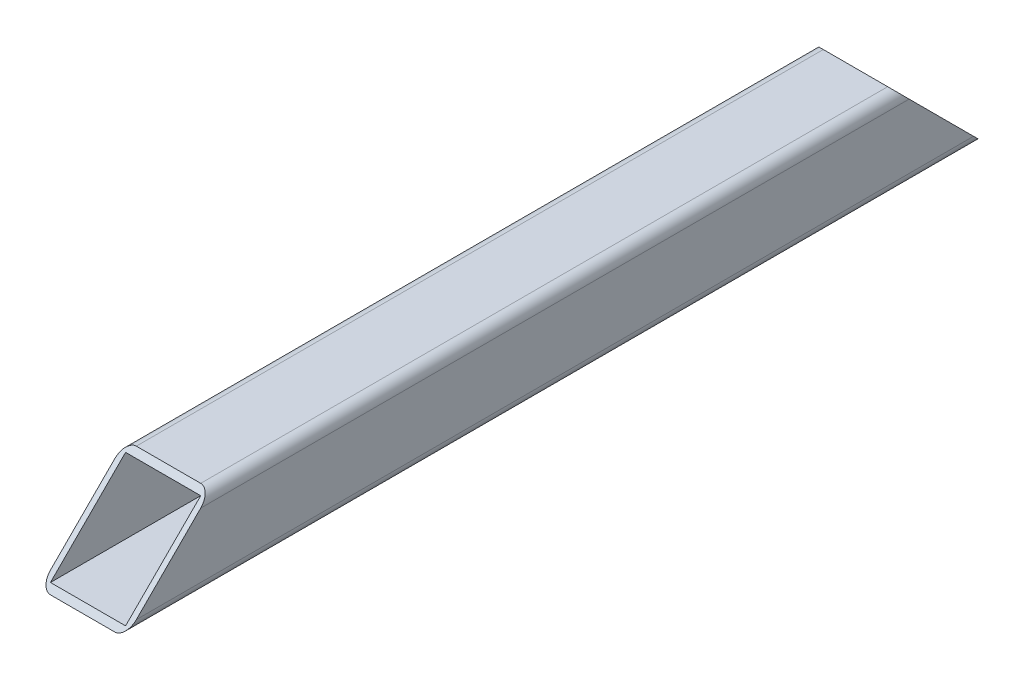
ISO-10303-21;
HEADER;
FILE_DESCRIPTION(('STEP AP214'),'2;1');
FILE_NAME('part.step','',(''),(''),'','','');
FILE_SCHEMA(('AUTOMOTIVE_DESIGN { 1 0 10303 214 1 1 1 1 }'));
ENDSEC;
DATA;
#1=APPLICATION_CONTEXT('core data for automotive mechanical design processes');
#2=APPLICATION_PROTOCOL_DEFINITION('international standard','automotive_design',2000,#1);
#3=PRODUCT_CONTEXT('',#1,'mechanical');
#4=PRODUCT('Part','Part','',(#3));
#5=PRODUCT_RELATED_PRODUCT_CATEGORY('part','',(#4));
#6=PRODUCT_DEFINITION_FORMATION('','',#4);
#7=PRODUCT_DEFINITION_CONTEXT('part definition',#1,'design');
#8=PRODUCT_DEFINITION('design','',#6,#7);
#9=PRODUCT_DEFINITION_SHAPE('','',#8);
#10=(LENGTH_UNIT() NAMED_UNIT(*) SI_UNIT(.MILLI.,.METRE.));
#11=(NAMED_UNIT(*) PLANE_ANGLE_UNIT() SI_UNIT($,.RADIAN.));
#12=(NAMED_UNIT(*) SI_UNIT($,.STERADIAN.) SOLID_ANGLE_UNIT());
#13=UNCERTAINTY_MEASURE_WITH_UNIT(LENGTH_MEASURE(1.E-05),#10,'distance_accuracy_value','');
#14=(GEOMETRIC_REPRESENTATION_CONTEXT(3) GLOBAL_UNCERTAINTY_ASSIGNED_CONTEXT((#13)) GLOBAL_UNIT_ASSIGNED_CONTEXT((#10,
#11,#12)) REPRESENTATION_CONTEXT('',''));
#15=CARTESIAN_POINT('',(0.,0.,0.));
#16=DIRECTION('',(0.,0.,1.));
#17=DIRECTION('',(1.,0.,0.));
#18=AXIS2_PLACEMENT_3D('',#15,#16,#17);
#19=CARTESIAN_POINT('',(-25.4,-25.4,254.));
#20=DIRECTION('',(1.,0.,0.));
#21=DIRECTION('',(0.,0.,-1.));
#22=AXIS2_PLACEMENT_3D('',#19,#20,#21);
#23=PLANE('',#22);
#24=DIRECTION('',(0.,0.,-1.));
#25=VECTOR('',#24,1.);
#26=CARTESIAN_POINT('',(-25.4,19.05,254.));
#27=LINE('',#26,#25);
#28=CARTESIAN_POINT('',(-25.4,19.05,209.55));
#29=VERTEX_POINT('',#28);
#30=CARTESIAN_POINT('',(-25.4,19.05,-209.55));
#31=VERTEX_POINT('',#30);
#32=EDGE_CURVE('E162',#29,#31,#27,.T.);
#33=ORIENTED_EDGE('',*,*,#32,.T.);
#34=DIRECTION('',(0.,0.707106781186551,0.707106781186544));
#35=VECTOR('',#34,1.);
#36=CARTESIAN_POINT('',(-25.4,-25.4,-254.));
#37=LINE('',#36,#35);
#38=CARTESIAN_POINT('',(-25.4,-19.05,-247.65));
#39=VERTEX_POINT('',#38);
#40=EDGE_CURVE('E207',#39,#31,#37,.T.);
#41=ORIENTED_EDGE('',*,*,#40,.F.);
#42=DIRECTION('',(0.,0.,-1.));
#43=VECTOR('',#42,1.);
#44=CARTESIAN_POINT('',(-25.4,-19.05,254.));
#45=LINE('',#44,#43);
#46=CARTESIAN_POINT('',(-25.4,-19.05,247.65));
#47=VERTEX_POINT('',#46);
#48=EDGE_CURVE('E166',#39,#47,#45,.F.);
#49=ORIENTED_EDGE('',*,*,#48,.T.);
#50=DIRECTION('',(0.,-0.707106781186551,0.707106781186544));
#51=VECTOR('',#50,1.);
#52=CARTESIAN_POINT('',(-25.4,-25.4,254.));
#53=LINE('',#52,#51);
#54=EDGE_CURVE('E197',#29,#47,#53,.T.);
#55=ORIENTED_EDGE('',*,*,#54,.F.);
#56=EDGE_LOOP('',(#33,#41,#49,#55));
#57=FACE_BOUND('',#56,.T.);
#58=ADVANCED_FACE('F38',(#57),#23,.F.);
#59=CARTESIAN_POINT('',(25.4,-25.4,254.));
#60=DIRECTION('',(0.,1.,0.));
#61=DIRECTION('',(-1.,0.,0.));
#62=AXIS2_PLACEMENT_3D('',#59,#60,#61);
#63=PLANE('',#62);
#64=DIRECTION('',(1.,0.,0.));
#65=VECTOR('',#64,1.);
#66=CARTESIAN_POINT('',(25.4,-25.4,-254.));
#67=LINE('',#66,#65);
#68=CARTESIAN_POINT('',(-19.05,-25.4,-254.));
#69=VERTEX_POINT('',#68);
#70=CARTESIAN_POINT('',(19.05,-25.4,-254.));
#71=VERTEX_POINT('',#70);
#72=EDGE_CURVE('E137',#69,#71,#67,.T.);
#73=ORIENTED_EDGE('',*,*,#72,.T.);
#74=DIRECTION('',(0.,0.,-1.));
#75=VECTOR('',#74,1.);
#76=CARTESIAN_POINT('',(19.05,-25.4,254.));
#77=LINE('',#76,#75);
#78=CARTESIAN_POINT('',(19.05,-25.4,254.));
#79=VERTEX_POINT('',#78);
#80=EDGE_CURVE('E152',#71,#79,#77,.F.);
#81=ORIENTED_EDGE('',*,*,#80,.T.);
#82=DIRECTION('',(1.,0.,0.));
#83=VECTOR('',#82,1.);
#84=CARTESIAN_POINT('',(25.4,-25.4,254.));
#85=LINE('',#84,#83);
#86=CARTESIAN_POINT('',(-19.05,-25.4,254.));
#87=VERTEX_POINT('',#86);
#88=EDGE_CURVE('E156',#87,#79,#85,.T.);
#89=ORIENTED_EDGE('',*,*,#88,.F.);
#90=DIRECTION('',(0.,0.,-1.));
#91=VECTOR('',#90,1.);
#92=CARTESIAN_POINT('',(-19.05,-25.4,254.));
#93=LINE('',#92,#91);
#94=EDGE_CURVE('E154',#87,#69,#93,.T.);
#95=ORIENTED_EDGE('',*,*,#94,.T.);
#96=EDGE_LOOP('',(#73,#81,#89,#95));
#97=FACE_BOUND('',#96,.T.);
#98=ADVANCED_FACE('F150',(#97),#63,.F.);
#99=CARTESIAN_POINT('',(25.4,-25.4,254.));
#100=DIRECTION('',(-1.,0.,0.));
#101=DIRECTION('',(0.,0.,1.));
#102=AXIS2_PLACEMENT_3D('',#99,#100,#101);
#103=PLANE('',#102);
#104=DIRECTION('',(0.,0.,-1.));
#105=VECTOR('',#104,1.);
#106=CARTESIAN_POINT('',(25.4,-19.05,254.));
#107=LINE('',#106,#105);
#108=CARTESIAN_POINT('',(25.4,-19.05,247.65));
#109=VERTEX_POINT('',#108);
#110=CARTESIAN_POINT('',(25.4,-19.05,-247.65));
#111=VERTEX_POINT('',#110);
#112=EDGE_CURVE('E169',#109,#111,#107,.T.);
#113=ORIENTED_EDGE('',*,*,#112,.T.);
#114=DIRECTION('',(0.,0.707106781186551,0.707106781186544));
#115=VECTOR('',#114,1.);
#116=CARTESIAN_POINT('',(25.4,228.6,-2.60902410786912E-12));
#117=LINE('',#116,#115);
#118=CARTESIAN_POINT('',(25.4,19.05,-209.55));
#119=VERTEX_POINT('',#118);
#120=EDGE_CURVE('E140',#111,#119,#117,.T.);
#121=ORIENTED_EDGE('',*,*,#120,.T.);
#122=DIRECTION('',(0.,0.,-1.));
#123=VECTOR('',#122,1.);
#124=CARTESIAN_POINT('',(25.4,19.05,254.));
#125=LINE('',#124,#123);
#126=CARTESIAN_POINT('',(25.4,19.05,209.55));
#127=VERTEX_POINT('',#126);
#128=EDGE_CURVE('E199',#119,#127,#125,.F.);
#129=ORIENTED_EDGE('',*,*,#128,.T.);
#130=DIRECTION('',(0.,-0.707106781186551,0.707106781186544));
#131=VECTOR('',#130,1.);
#132=CARTESIAN_POINT('',(25.4,-25.4,254.));
#133=LINE('',#132,#131);
#134=EDGE_CURVE('E190',#127,#109,#133,.T.);
#135=ORIENTED_EDGE('',*,*,#134,.T.);
#136=EDGE_LOOP('',(#113,#121,#129,#135));
#137=FACE_BOUND('',#136,.T.);
#138=ADVANCED_FACE('F201',(#137),#103,.F.);
#139=CARTESIAN_POINT('',(25.4,25.4,254.));
#140=DIRECTION('',(0.,-1.,0.));
#141=DIRECTION('',(1.,0.,0.));
#142=AXIS2_PLACEMENT_3D('',#139,#140,#141);
#143=PLANE('',#142);
#144=DIRECTION('',(0.,0.,-1.));
#145=VECTOR('',#144,1.);
#146=CARTESIAN_POINT('',(19.05,25.4,254.));
#147=LINE('',#146,#145);
#148=CARTESIAN_POINT('',(19.0500000000002,25.4,203.200000000001));
#149=VERTEX_POINT('',#148);
#150=CARTESIAN_POINT('',(19.05,25.4,-203.200000000001));
#151=VERTEX_POINT('',#150);
#152=EDGE_CURVE('E175',#149,#151,#147,.T.);
#153=ORIENTED_EDGE('',*,*,#152,.T.);
#154=DIRECTION('',(-1.,0.,0.));
#155=VECTOR('',#154,1.);
#156=CARTESIAN_POINT('',(889.,25.4,-203.200000000001));
#157=LINE('',#156,#155);
#158=CARTESIAN_POINT('',(-19.05,25.4,-203.200000000001));
#159=VERTEX_POINT('',#158);
#160=EDGE_CURVE('E64',#151,#159,#157,.T.);
#161=ORIENTED_EDGE('',*,*,#160,.T.);
#162=DIRECTION('',(0.,0.,-1.));
#163=VECTOR('',#162,1.);
#164=CARTESIAN_POINT('',(-19.05,25.4,254.));
#165=LINE('',#164,#163);
#166=CARTESIAN_POINT('',(-19.0499999999998,25.4,203.200000000001));
#167=VERTEX_POINT('',#166);
#168=EDGE_CURVE('E179',#159,#167,#165,.F.);
#169=ORIENTED_EDGE('',*,*,#168,.T.);
#170=DIRECTION('',(-1.,0.,0.));
#171=VECTOR('',#170,1.);
#172=CARTESIAN_POINT('',(889.,25.4,203.200000000001));
#173=LINE('',#172,#171);
#174=EDGE_CURVE('E187',#149,#167,#173,.T.);
#175=ORIENTED_EDGE('',*,*,#174,.F.);
#176=EDGE_LOOP('',(#153,#161,#169,#175));
#177=FACE_BOUND('',#176,.T.);
#178=ADVANCED_FACE('F195',(#177),#143,.F.);
#179=CARTESIAN_POINT('',(-22.225,-22.225,254.));
#180=DIRECTION('',(1.,0.,0.));
#181=DIRECTION('',(0.,0.,-1.));
#182=AXIS2_PLACEMENT_3D('',#179,#180,#181);
#183=PLANE('',#182);
#184=DIRECTION('',(0.,-0.707106781186551,-0.707106781186544));
#185=VECTOR('',#184,1.);
#186=CARTESIAN_POINT('',(-22.225,230.1875,1.58749999999735));
#187=LINE('',#186,#185);
#188=CARTESIAN_POINT('',(-22.225,22.225,-206.375));
#189=VERTEX_POINT('',#188);
#190=CARTESIAN_POINT('',(-22.225,-22.225,-250.825));
#191=VERTEX_POINT('',#190);
#192=EDGE_CURVE('E224',#189,#191,#187,.T.);
#193=ORIENTED_EDGE('',*,*,#192,.F.);
#194=DIRECTION('',(0.,0.,-1.));
#195=VECTOR('',#194,1.);
#196=CARTESIAN_POINT('',(-22.225,22.225,254.));
#197=LINE('',#196,#195);
#198=CARTESIAN_POINT('',(-22.225,22.225,206.375000000001));
#199=VERTEX_POINT('',#198);
#200=EDGE_CURVE('E243',#199,#189,#197,.T.);
#201=ORIENTED_EDGE('',*,*,#200,.F.);
#202=DIRECTION('',(0.,0.707106781186551,-0.707106781186544));
#203=VECTOR('',#202,1.);
#204=CARTESIAN_POINT('',(-22.225,-23.8125,252.4125));
#205=LINE('',#204,#203);
#206=CARTESIAN_POINT('',(-22.225,-22.225,250.825));
#207=VERTEX_POINT('',#206);
#208=EDGE_CURVE('E241',#207,#199,#205,.T.);
#209=ORIENTED_EDGE('',*,*,#208,.F.);
#210=DIRECTION('',(0.,0.,-1.));
#211=VECTOR('',#210,1.);
#212=CARTESIAN_POINT('',(-22.225,-22.225,254.));
#213=LINE('',#212,#211);
#214=EDGE_CURVE('E157',#207,#191,#213,.T.);
#215=ORIENTED_EDGE('',*,*,#214,.T.);
#216=EDGE_LOOP('',(#193,#201,#209,#215));
#217=FACE_BOUND('',#216,.T.);
#218=ADVANCED_FACE('F288',(#217),#183,.T.);
#219=CARTESIAN_POINT('',(22.225,-22.225,254.));
#220=DIRECTION('',(0.,1.,0.));
#221=DIRECTION('',(0.,0.,1.));
#222=AXIS2_PLACEMENT_3D('',#219,#220,#221);
#223=PLANE('',#222);
#224=DIRECTION('',(1.,0.,0.));
#225=VECTOR('',#224,1.);
#226=CARTESIAN_POINT('',(22.225,-22.225,-250.825));
#227=LINE('',#226,#225);
#228=CARTESIAN_POINT('',(22.225,-22.225,-250.825));
#229=VERTEX_POINT('',#228);
#230=EDGE_CURVE('E221',#191,#229,#227,.T.);
#231=ORIENTED_EDGE('',*,*,#230,.F.);
#232=ORIENTED_EDGE('',*,*,#214,.F.);
#233=DIRECTION('',(-1.,0.,0.));
#234=VECTOR('',#233,1.);
#235=CARTESIAN_POINT('',(22.225,-22.225,250.825));
#236=LINE('',#235,#234);
#237=CARTESIAN_POINT('',(22.225,-22.225,250.825));
#238=VERTEX_POINT('',#237);
#239=EDGE_CURVE('E239',#238,#207,#236,.T.);
#240=ORIENTED_EDGE('',*,*,#239,.F.);
#241=DIRECTION('',(0.,0.,-1.));
#242=VECTOR('',#241,1.);
#243=CARTESIAN_POINT('',(22.225,-22.225,254.));
#244=LINE('',#243,#242);
#245=EDGE_CURVE('E250',#238,#229,#244,.T.);
#246=ORIENTED_EDGE('',*,*,#245,.T.);
#247=EDGE_LOOP('',(#231,#232,#240,#246));
#248=FACE_BOUND('',#247,.T.);
#249=ADVANCED_FACE('F291',(#248),#223,.T.);
#250=CARTESIAN_POINT('',(22.225,-22.225,254.));
#251=DIRECTION('',(-1.,0.,0.));
#252=DIRECTION('',(0.,0.,1.));
#253=AXIS2_PLACEMENT_3D('',#250,#251,#252);
#254=PLANE('',#253);
#255=DIRECTION('',(0.,0.707106781186551,0.707106781186544));
#256=VECTOR('',#255,1.);
#257=CARTESIAN_POINT('',(22.225,230.1875,1.58749999999735));
#258=LINE('',#257,#256);
#259=CARTESIAN_POINT('',(22.225,22.225,-206.375));
#260=VERTEX_POINT('',#259);
#261=EDGE_CURVE('E57',#229,#260,#258,.T.);
#262=ORIENTED_EDGE('',*,*,#261,.F.);
#263=ORIENTED_EDGE('',*,*,#245,.F.);
#264=DIRECTION('',(0.,-0.707106781186551,0.707106781186544));
#265=VECTOR('',#264,1.);
#266=CARTESIAN_POINT('',(22.225,-23.8125,252.4125));
#267=LINE('',#266,#265);
#268=CARTESIAN_POINT('',(22.225,22.225,206.375000000001));
#269=VERTEX_POINT('',#268);
#270=EDGE_CURVE('E237',#269,#238,#267,.T.);
#271=ORIENTED_EDGE('',*,*,#270,.F.);
#272=DIRECTION('',(0.,0.,-1.));
#273=VECTOR('',#272,1.);
#274=CARTESIAN_POINT('',(22.225,22.225,254.));
#275=LINE('',#274,#273);
#276=EDGE_CURVE('E247',#269,#260,#275,.T.);
#277=ORIENTED_EDGE('',*,*,#276,.T.);
#278=EDGE_LOOP('',(#262,#263,#271,#277));
#279=FACE_BOUND('',#278,.T.);
#280=ADVANCED_FACE('F295',(#279),#254,.T.);
#281=CARTESIAN_POINT('',(22.225,22.225,254.));
#282=DIRECTION('',(0.,-1.,0.));
#283=DIRECTION('',(0.,0.,-1.));
#284=AXIS2_PLACEMENT_3D('',#281,#282,#283);
#285=PLANE('',#284);
#286=DIRECTION('',(-1.,0.,0.));
#287=VECTOR('',#286,1.);
#288=CARTESIAN_POINT('',(22.225,22.225,-206.375));
#289=LINE('',#288,#287);
#290=EDGE_CURVE('E216',#260,#189,#289,.T.);
#291=ORIENTED_EDGE('',*,*,#290,.F.);
#292=ORIENTED_EDGE('',*,*,#276,.F.);
#293=DIRECTION('',(1.,0.,0.));
#294=VECTOR('',#293,1.);
#295=CARTESIAN_POINT('',(22.225,22.225,206.375000000001));
#296=LINE('',#295,#294);
#297=EDGE_CURVE('E235',#199,#269,#296,.T.);
#298=ORIENTED_EDGE('',*,*,#297,.F.);
#299=ORIENTED_EDGE('',*,*,#200,.T.);
#300=EDGE_LOOP('',(#291,#292,#298,#299));
#301=FACE_BOUND('',#300,.T.);
#302=ADVANCED_FACE('F275',(#301),#285,.T.);
#303=CARTESIAN_POINT('',(19.05,-19.05,254.));
#304=DIRECTION('',(0.,0.,-1.));
#305=DIRECTION('',(-1.,0.,0.));
#306=AXIS2_PLACEMENT_3D('',#303,#304,#305);
#307=CYLINDRICAL_SURFACE('',#306,6.35);
#308=CARTESIAN_POINT('',(19.05,-19.05,-247.65));
#309=DIRECTION('',(0.,-0.707106781186544,0.707106781186551));
#310=DIRECTION('',(0.,-0.707106781186551,-0.707106781186544));
#311=AXIS2_PLACEMENT_3D('',#308,#309,#310);
#312=ELLIPSE('',#311,8.98025612106911,6.35);
#313=EDGE_CURVE('E134',#111,#71,#312,.F.);
#314=ORIENTED_EDGE('',*,*,#313,.F.);
#315=ORIENTED_EDGE('',*,*,#112,.F.);
#316=CARTESIAN_POINT('',(19.05,-19.05,247.65));
#317=DIRECTION('',(0.,-0.707106781186544,-0.707106781186551));
#318=DIRECTION('',(0.,0.707106781186551,-0.707106781186544));
#319=AXIS2_PLACEMENT_3D('',#316,#317,#318);
#320=ELLIPSE('',#319,8.98025612106911,6.35);
#321=EDGE_CURVE('E161',#79,#109,#320,.F.);
#322=ORIENTED_EDGE('',*,*,#321,.F.);
#323=ORIENTED_EDGE('',*,*,#80,.F.);
#324=EDGE_LOOP('',(#314,#315,#322,#323));
#325=FACE_BOUND('',#324,.T.);
#326=ADVANCED_FACE('F160',(#325),#307,.T.);
#327=CARTESIAN_POINT('',(-19.05,-19.05,254.));
#328=DIRECTION('',(0.,0.,-1.));
#329=DIRECTION('',(-1.,0.,0.));
#330=AXIS2_PLACEMENT_3D('',#327,#328,#329);
#331=CYLINDRICAL_SURFACE('',#330,6.35);
#332=CARTESIAN_POINT('',(-19.05,-19.05,-247.65));
#333=DIRECTION('',(0.,-0.707106781186544,0.707106781186551));
#334=DIRECTION('',(0.,-0.707106781186551,-0.707106781186544));
#335=AXIS2_PLACEMENT_3D('',#332,#333,#334);
#336=ELLIPSE('',#335,8.98025612106911,6.35);
#337=EDGE_CURVE('E213',#69,#39,#336,.F.);
#338=ORIENTED_EDGE('',*,*,#337,.F.);
#339=ORIENTED_EDGE('',*,*,#94,.F.);
#340=CARTESIAN_POINT('',(-19.05,-19.05,247.65));
#341=DIRECTION('',(0.,-0.707106781186544,-0.707106781186551));
#342=DIRECTION('',(0.,0.707106781186551,-0.707106781186544));
#343=AXIS2_PLACEMENT_3D('',#340,#341,#342);
#344=ELLIPSE('',#343,8.98025612106911,6.35);
#345=EDGE_CURVE('E233',#47,#87,#344,.F.);
#346=ORIENTED_EDGE('',*,*,#345,.F.);
#347=ORIENTED_EDGE('',*,*,#48,.F.);
#348=EDGE_LOOP('',(#338,#339,#346,#347));
#349=FACE_BOUND('',#348,.T.);
#350=ADVANCED_FACE('F268',(#349),#331,.T.);
#351=CARTESIAN_POINT('',(-19.05,19.05,254.));
#352=DIRECTION('',(0.,0.,-1.));
#353=DIRECTION('',(-1.,0.,0.));
#354=AXIS2_PLACEMENT_3D('',#351,#352,#353);
#355=CYLINDRICAL_SURFACE('',#354,6.35);
#356=CARTESIAN_POINT('',(-19.05,19.05,-209.55));
#357=DIRECTION('',(0.,-0.707106781186544,0.707106781186551));
#358=DIRECTION('',(0.,-0.707106781186551,-0.707106781186544));
#359=AXIS2_PLACEMENT_3D('',#356,#357,#358);
#360=ELLIPSE('',#359,8.98025612106911,6.35);
#361=EDGE_CURVE('E145',#31,#159,#360,.F.);
#362=ORIENTED_EDGE('',*,*,#361,.F.);
#363=ORIENTED_EDGE('',*,*,#32,.F.);
#364=CARTESIAN_POINT('',(-19.05,19.05,209.55));
#365=DIRECTION('',(0.,-0.707106781186544,-0.707106781186551));
#366=DIRECTION('',(0.,0.707106781186551,-0.707106781186544));
#367=AXIS2_PLACEMENT_3D('',#364,#365,#366);
#368=ELLIPSE('',#367,8.98025612106911,6.35);
#369=EDGE_CURVE('E231',#167,#29,#368,.F.);
#370=ORIENTED_EDGE('',*,*,#369,.F.);
#371=ORIENTED_EDGE('',*,*,#168,.F.);
#372=EDGE_LOOP('',(#362,#363,#370,#371));
#373=FACE_BOUND('',#372,.T.);
#374=ADVANCED_FACE('F264',(#373),#355,.T.);
#375=CARTESIAN_POINT('',(19.05,19.05,254.));
#376=DIRECTION('',(0.,0.,-1.));
#377=DIRECTION('',(-1.,0.,0.));
#378=AXIS2_PLACEMENT_3D('',#375,#376,#377);
#379=CYLINDRICAL_SURFACE('',#378,6.35);
#380=CARTESIAN_POINT('',(19.05,19.05,-209.55));
#381=DIRECTION('',(0.,-0.707106781186544,0.707106781186551));
#382=DIRECTION('',(0.,-0.707106781186551,-0.707106781186544));
#383=AXIS2_PLACEMENT_3D('',#380,#381,#382);
#384=ELLIPSE('',#383,8.98025612106911,6.35);
#385=EDGE_CURVE('E11',#151,#119,#384,.F.);
#386=ORIENTED_EDGE('',*,*,#385,.F.);
#387=ORIENTED_EDGE('',*,*,#152,.F.);
#388=CARTESIAN_POINT('',(19.05,19.05,209.55));
#389=DIRECTION('',(0.,-0.707106781186544,-0.707106781186551));
#390=DIRECTION('',(0.,0.707106781186551,-0.707106781186544));
#391=AXIS2_PLACEMENT_3D('',#388,#389,#390);
#392=ELLIPSE('',#391,8.98025612106911,6.35);
#393=EDGE_CURVE('E47',#127,#149,#392,.F.);
#394=ORIENTED_EDGE('',*,*,#393,.F.);
#395=ORIENTED_EDGE('',*,*,#128,.F.);
#396=EDGE_LOOP('',(#386,#387,#394,#395));
#397=FACE_BOUND('',#396,.T.);
#398=ADVANCED_FACE('F40',(#397),#379,.T.);
#399=CARTESIAN_POINT('',(889.,-25.4,254.));
#400=DIRECTION('',(0.,-0.707106781186544,-0.707106781186551));
#401=DIRECTION('',(0.,0.707106781186551,-0.707106781186544));
#402=AXIS2_PLACEMENT_3D('',#399,#400,#401);
#403=PLANE('',#402);
#404=ORIENTED_EDGE('',*,*,#208,.T.);
#405=ORIENTED_EDGE('',*,*,#297,.T.);
#406=ORIENTED_EDGE('',*,*,#270,.T.);
#407=ORIENTED_EDGE('',*,*,#239,.T.);
#408=EDGE_LOOP('',(#404,#405,#406,#407));
#409=FACE_BOUND('',#408,.T.);
#410=ORIENTED_EDGE('',*,*,#345,.T.);
#411=ORIENTED_EDGE('',*,*,#88,.T.);
#412=ORIENTED_EDGE('',*,*,#321,.T.);
#413=ORIENTED_EDGE('',*,*,#134,.F.);
#414=ORIENTED_EDGE('',*,*,#393,.T.);
#415=ORIENTED_EDGE('',*,*,#174,.T.);
#416=ORIENTED_EDGE('',*,*,#369,.T.);
#417=ORIENTED_EDGE('',*,*,#54,.T.);
#418=EDGE_LOOP('',(#410,#411,#412,#413,#414,#415,#416,#417));
#419=FACE_BOUND('',#418,.T.);
#420=ADVANCED_FACE('F186',(#409,#419),#403,.F.);
#421=CARTESIAN_POINT('',(889.,-25.4,-254.));
#422=DIRECTION('',(0.,-0.707106781186544,0.707106781186551));
#423=DIRECTION('',(0.,-0.707106781186551,-0.707106781186544));
#424=AXIS2_PLACEMENT_3D('',#421,#422,#423);
#425=PLANE('',#424);
#426=ORIENTED_EDGE('',*,*,#192,.T.);
#427=ORIENTED_EDGE('',*,*,#230,.T.);
#428=ORIENTED_EDGE('',*,*,#261,.T.);
#429=ORIENTED_EDGE('',*,*,#290,.T.);
#430=EDGE_LOOP('',(#426,#427,#428,#429));
#431=FACE_BOUND('',#430,.T.);
#432=ORIENTED_EDGE('',*,*,#337,.T.);
#433=ORIENTED_EDGE('',*,*,#40,.T.);
#434=ORIENTED_EDGE('',*,*,#361,.T.);
#435=ORIENTED_EDGE('',*,*,#160,.F.);
#436=ORIENTED_EDGE('',*,*,#385,.T.);
#437=ORIENTED_EDGE('',*,*,#120,.F.);
#438=ORIENTED_EDGE('',*,*,#313,.T.);
#439=ORIENTED_EDGE('',*,*,#72,.F.);
#440=EDGE_LOOP('',(#432,#433,#434,#435,#436,#437,#438,#439));
#441=FACE_BOUND('',#440,.T.);
#442=ADVANCED_FACE('F136',(#431,#441),#425,.F.);
#443=CLOSED_SHELL('',(#58,#98,#138,#178,#218,#249,#280,#302,#326,#350,#374,#398,#420,#442));
#444=MANIFOLD_SOLID_BREP('B2',#443);
#445=ADVANCED_BREP_SHAPE_REPRESENTATION('',(#18,#444),#14);
#446=SHAPE_DEFINITION_REPRESENTATION(#9,#445);
ENDSEC;
END-ISO-10303-21;
